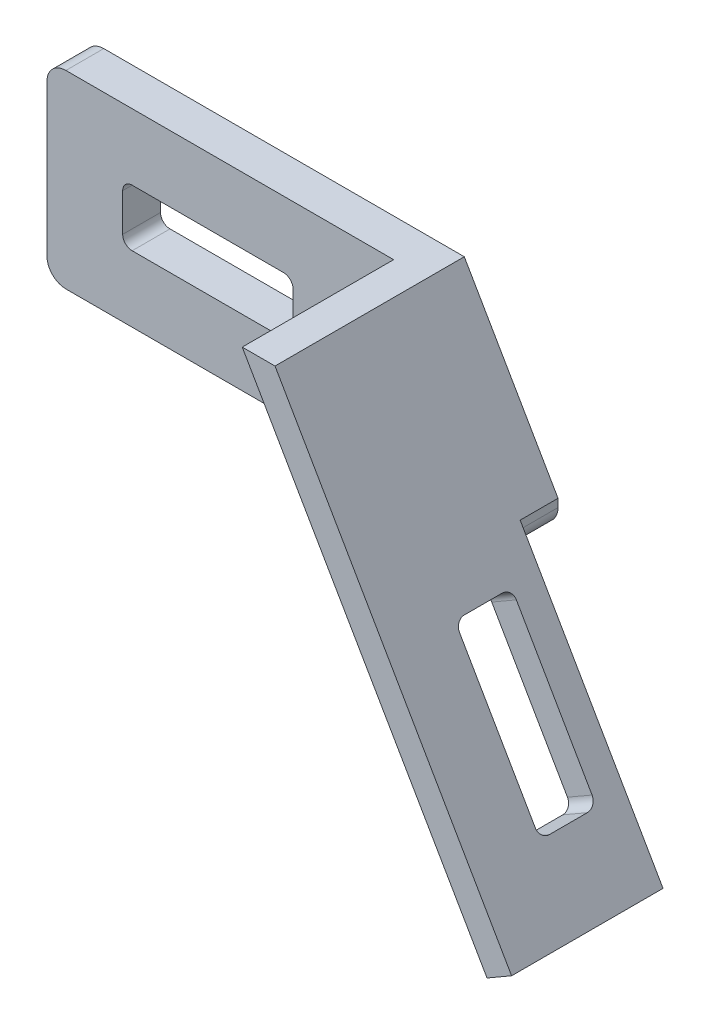
ISO-10303-21;
HEADER;
FILE_DESCRIPTION(('STEP AP214'),'2;1');
FILE_NAME('part.step','',(''),(''),'','','');
FILE_SCHEMA(('AUTOMOTIVE_DESIGN { 1 0 10303 214 1 1 1 1 }'));
ENDSEC;
DATA;
#1=APPLICATION_CONTEXT('core data for automotive mechanical design processes');
#2=APPLICATION_PROTOCOL_DEFINITION('international standard','automotive_design',2000,#1);
#3=PRODUCT_CONTEXT('',#1,'mechanical');
#4=PRODUCT('Part','Part','',(#3));
#5=PRODUCT_RELATED_PRODUCT_CATEGORY('part','',(#4));
#6=PRODUCT_DEFINITION_FORMATION('','',#4);
#7=PRODUCT_DEFINITION_CONTEXT('part definition',#1,'design');
#8=PRODUCT_DEFINITION('design','',#6,#7);
#9=PRODUCT_DEFINITION_SHAPE('','',#8);
#10=(LENGTH_UNIT() NAMED_UNIT(*) SI_UNIT(.MILLI.,.METRE.));
#11=(NAMED_UNIT(*) PLANE_ANGLE_UNIT() SI_UNIT($,.RADIAN.));
#12=(NAMED_UNIT(*) SI_UNIT($,.STERADIAN.) SOLID_ANGLE_UNIT());
#13=UNCERTAINTY_MEASURE_WITH_UNIT(LENGTH_MEASURE(1.E-05),#10,'distance_accuracy_value','');
#14=(GEOMETRIC_REPRESENTATION_CONTEXT(3) GLOBAL_UNCERTAINTY_ASSIGNED_CONTEXT((#13)) GLOBAL_UNIT_ASSIGNED_CONTEXT((#10,
#11,#12)) REPRESENTATION_CONTEXT('',''));
#15=CARTESIAN_POINT('',(0.,0.,0.));
#16=DIRECTION('',(0.,0.,1.));
#17=DIRECTION('',(1.,0.,0.));
#18=AXIS2_PLACEMENT_3D('',#15,#16,#17);
#19=CARTESIAN_POINT('',(34.7267267267267,6.70870870870871,4.));
#20=DIRECTION('',(0.,0.,-1.));
#21=DIRECTION('',(-1.,0.,0.));
#22=AXIS2_PLACEMENT_3D('',#19,#20,#21);
#23=PLANE('',#22);
#24=DIRECTION('',(0.,-1.,0.));
#25=VECTOR('',#24,1.);
#26=CARTESIAN_POINT('',(-5.27327327327327,0.708708708708703,4.));
#27=LINE('',#26,#25);
#28=CARTESIAN_POINT('',(-5.27327327327327,0.708708708708703,4.));
#29=VERTEX_POINT('',#28);
#30=CARTESIAN_POINT('',(-5.27327327327327,-3.29129129129128,4.));
#31=VERTEX_POINT('',#30);
#32=EDGE_CURVE('E449',#29,#31,#27,.T.);
#33=ORIENTED_EDGE('',*,*,#32,.F.);
#34=CARTESIAN_POINT('',(-4.27327327327327,0.708708708708711,4.));
#35=DIRECTION('',(0.,0.,1.));
#36=DIRECTION('',(-1.,0.,0.));
#37=AXIS2_PLACEMENT_3D('',#34,#35,#36);
#38=CIRCLE('',#37,1.);
#39=CARTESIAN_POINT('',(-4.27327327327327,1.70870870870871,4.));
#40=VERTEX_POINT('',#39);
#41=EDGE_CURVE('E447',#40,#29,#38,.T.);
#42=ORIENTED_EDGE('',*,*,#41,.F.);
#43=DIRECTION('',(-1.,0.,0.));
#44=VECTOR('',#43,1.);
#45=CARTESIAN_POINT('',(-4.27327327327327,1.70870870870871,4.));
#46=LINE('',#45,#44);
#47=CARTESIAN_POINT('',(11.7267267267267,1.70870870870871,4.));
#48=VERTEX_POINT('',#47);
#49=EDGE_CURVE('E335',#48,#40,#46,.T.);
#50=ORIENTED_EDGE('',*,*,#49,.F.);
#51=CARTESIAN_POINT('',(11.7267267267267,0.708708708708711,4.));
#52=DIRECTION('',(0.,0.,1.));
#53=DIRECTION('',(1.,0.,0.));
#54=AXIS2_PLACEMENT_3D('',#51,#52,#53);
#55=CIRCLE('',#54,1.);
#56=CARTESIAN_POINT('',(12.7267267267267,0.708708708708703,4.));
#57=VERTEX_POINT('',#56);
#58=EDGE_CURVE('E304',#57,#48,#55,.T.);
#59=ORIENTED_EDGE('',*,*,#58,.F.);
#60=DIRECTION('',(0.,1.,0.));
#61=VECTOR('',#60,1.);
#62=CARTESIAN_POINT('',(12.7267267267267,0.708708708708703,4.));
#63=LINE('',#62,#61);
#64=CARTESIAN_POINT('',(12.7267267267267,-3.29129129129129,4.));
#65=VERTEX_POINT('',#64);
#66=EDGE_CURVE('E459',#65,#57,#63,.T.);
#67=ORIENTED_EDGE('',*,*,#66,.F.);
#68=CARTESIAN_POINT('',(11.7267267267267,-3.29129129129129,4.));
#69=DIRECTION('',(0.,0.,1.));
#70=DIRECTION('',(1.,0.,0.));
#71=AXIS2_PLACEMENT_3D('',#68,#69,#70);
#72=CIRCLE('',#71,1.);
#73=CARTESIAN_POINT('',(11.7267267267267,-4.29129129129129,4.));
#74=VERTEX_POINT('',#73);
#75=EDGE_CURVE('E321',#74,#65,#72,.T.);
#76=ORIENTED_EDGE('',*,*,#75,.F.);
#77=DIRECTION('',(1.,0.,0.));
#78=VECTOR('',#77,1.);
#79=CARTESIAN_POINT('',(-4.27327327327327,-4.29129129129129,4.));
#80=LINE('',#79,#78);
#81=CARTESIAN_POINT('',(-4.27327327327327,-4.29129129129129,4.));
#82=VERTEX_POINT('',#81);
#83=EDGE_CURVE('E455',#82,#74,#80,.T.);
#84=ORIENTED_EDGE('',*,*,#83,.F.);
#85=CARTESIAN_POINT('',(-4.27327327327327,-3.29129129129129,4.));
#86=DIRECTION('',(0.,0.,1.));
#87=DIRECTION('',(1.,0.,0.));
#88=AXIS2_PLACEMENT_3D('',#85,#86,#87);
#89=CIRCLE('',#88,1.);
#90=EDGE_CURVE('E452',#31,#82,#89,.T.);
#91=ORIENTED_EDGE('',*,*,#90,.F.);
#92=EDGE_LOOP('',(#33,#42,#50,#59,#67,#76,#84,#91));
#93=FACE_BOUND('',#92,.T.);
#94=DIRECTION('',(0.500000000000005,-0.866025403784436,0.));
#95=VECTOR('',#94,1.);
#96=CARTESIAN_POINT('',(49.2252519929675,-36.0925614805131,4.));
#97=LINE('',#96,#95);
#98=CARTESIAN_POINT('',(23.3592265891828,8.70870870870871,4.));
#99=VERTEX_POINT('',#98);
#100=CARTESIAN_POINT('',(34.901799452728,-11.2836139410171,4.));
#101=VERTEX_POINT('',#100);
#102=EDGE_CURVE('E430',#99,#101,#97,.T.);
#103=ORIENTED_EDGE('',*,*,#102,.F.);
#104=DIRECTION('',(-1.,0.,0.));
#105=VECTOR('',#104,1.);
#106=CARTESIAN_POINT('',(-11.2732732732733,8.70870870870871,4.));
#107=LINE('',#106,#105);
#108=CARTESIAN_POINT('',(-11.2732732732733,8.70870870870871,4.));
#109=VERTEX_POINT('',#108);
#110=EDGE_CURVE('E261',#99,#109,#107,.T.);
#111=ORIENTED_EDGE('',*,*,#110,.T.);
#112=CARTESIAN_POINT('',(-11.2732732732733,6.70870870870871,4.));
#113=DIRECTION('',(0.,0.,1.));
#114=DIRECTION('',(-1.,0.,0.));
#115=AXIS2_PLACEMENT_3D('',#112,#113,#114);
#116=CIRCLE('',#115,2.);
#117=CARTESIAN_POINT('',(-13.2732732732733,6.7087087087087,4.));
#118=VERTEX_POINT('',#117);
#119=EDGE_CURVE('E337',#109,#118,#116,.T.);
#120=ORIENTED_EDGE('',*,*,#119,.T.);
#121=DIRECTION('',(0.,-1.,0.));
#122=VECTOR('',#121,1.);
#123=CARTESIAN_POINT('',(-13.2732732732733,6.7087087087087,4.));
#124=LINE('',#123,#122);
#125=CARTESIAN_POINT('',(-13.2732732732733,-9.29129129129128,4.));
#126=VERTEX_POINT('',#125);
#127=EDGE_CURVE('E339',#118,#126,#124,.T.);
#128=ORIENTED_EDGE('',*,*,#127,.T.);
#129=CARTESIAN_POINT('',(-11.2732732732733,-9.29129129129129,4.));
#130=DIRECTION('',(0.,0.,1.));
#131=DIRECTION('',(-1.,0.,0.));
#132=AXIS2_PLACEMENT_3D('',#129,#130,#131);
#133=CIRCLE('',#132,2.);
#134=CARTESIAN_POINT('',(-11.2732732732733,-11.2912912912913,4.));
#135=VERTEX_POINT('',#134);
#136=EDGE_CURVE('E341',#126,#135,#133,.T.);
#137=ORIENTED_EDGE('',*,*,#136,.T.);
#138=DIRECTION('',(1.,0.,0.));
#139=VECTOR('',#138,1.);
#140=CARTESIAN_POINT('',(-11.2732732732733,-11.2912912912913,4.));
#141=LINE('',#140,#139);
#142=CARTESIAN_POINT('',(34.7267267267267,-11.2912912912913,4.));
#143=VERTEX_POINT('',#142);
#144=EDGE_CURVE('E343',#135,#143,#141,.T.);
#145=ORIENTED_EDGE('',*,*,#144,.T.);
#146=CARTESIAN_POINT('',(34.7267267267267,-9.29129129129129,4.));
#147=DIRECTION('',(0.,0.,1.));
#148=DIRECTION('',(-1.,0.,0.));
#149=AXIS2_PLACEMENT_3D('',#146,#147,#148);
#150=CIRCLE('',#149,2.);
#151=EDGE_CURVE('E345',#143,#101,#150,.T.);
#152=ORIENTED_EDGE('',*,*,#151,.T.);
#153=EDGE_LOOP('',(#103,#111,#120,#128,#137,#145,#152));
#154=FACE_BOUND('',#153,.T.);
#155=ADVANCED_FACE('F35',(#93,#154),#23,.F.);
#156=CARTESIAN_POINT('',(-11.2732732732733,8.70870870870871,4.));
#157=DIRECTION('',(0.,-1.,0.));
#158=DIRECTION('',(0.,0.,-1.));
#159=AXIS2_PLACEMENT_3D('',#156,#157,#158);
#160=PLANE('',#159);
#161=DIRECTION('',(0.,0.,-1.));
#162=VECTOR('',#161,1.);
#163=CARTESIAN_POINT('',(26.8233282043206,8.70870870870871,20.));
#164=LINE('',#163,#162);
#165=CARTESIAN_POINT('',(26.8233282043206,8.70870870870871,20.));
#166=VERTEX_POINT('',#165);
#167=CARTESIAN_POINT('',(26.8233282043206,8.70870870870871,0.));
#168=VERTEX_POINT('',#167);
#169=EDGE_CURVE('E216',#166,#168,#164,.T.);
#170=ORIENTED_EDGE('',*,*,#169,.T.);
#171=DIRECTION('',(-1.,0.,0.));
#172=VECTOR('',#171,1.);
#173=CARTESIAN_POINT('',(-11.2732732732733,8.70870870870871,0.));
#174=LINE('',#173,#172);
#175=CARTESIAN_POINT('',(-11.2732732732733,8.70870870870871,0.));
#176=VERTEX_POINT('',#175);
#177=EDGE_CURVE('E220',#168,#176,#174,.T.);
#178=ORIENTED_EDGE('',*,*,#177,.T.);
#179=DIRECTION('',(0.,0.,-1.));
#180=VECTOR('',#179,1.);
#181=CARTESIAN_POINT('',(-11.2732732732733,8.70870870870871,4.));
#182=LINE('',#181,#180);
#183=EDGE_CURVE('E277',#109,#176,#182,.T.);
#184=ORIENTED_EDGE('',*,*,#183,.F.);
#185=ORIENTED_EDGE('',*,*,#110,.F.);
#186=DIRECTION('',(0.,0.,-1.));
#187=VECTOR('',#186,1.);
#188=CARTESIAN_POINT('',(23.3592265891828,8.70870870870871,20.));
#189=LINE('',#188,#187);
#190=CARTESIAN_POINT('',(23.3592265891828,8.70870870870871,20.));
#191=VERTEX_POINT('',#190);
#192=EDGE_CURVE('E226',#191,#99,#189,.T.);
#193=ORIENTED_EDGE('',*,*,#192,.F.);
#194=DIRECTION('',(-1.,0.,0.));
#195=VECTOR('',#194,1.);
#196=CARTESIAN_POINT('',(25.6686276659413,8.70870870870871,20.));
#197=LINE('',#196,#195);
#198=EDGE_CURVE('E223',#166,#191,#197,.T.);
#199=ORIENTED_EDGE('',*,*,#198,.F.);
#200=EDGE_LOOP('',(#170,#178,#184,#185,#193,#199));
#201=FACE_BOUND('',#200,.T.);
#202=ADVANCED_FACE('F37',(#201),#160,.F.);
#203=CARTESIAN_POINT('',(-11.2732732732733,6.70870870870871,4.));
#204=DIRECTION('',(0.,0.,-1.));
#205=DIRECTION('',(-1.,0.,0.));
#206=AXIS2_PLACEMENT_3D('',#203,#204,#205);
#207=CYLINDRICAL_SURFACE('',#206,2.);
#208=CARTESIAN_POINT('',(-11.2732732732733,6.70870870870871,0.));
#209=DIRECTION('',(0.,0.,1.));
#210=DIRECTION('',(-1.,0.,0.));
#211=AXIS2_PLACEMENT_3D('',#208,#209,#210);
#212=CIRCLE('',#211,2.);
#213=CARTESIAN_POINT('',(-13.2732732732733,6.7087087087087,0.));
#214=VERTEX_POINT('',#213);
#215=EDGE_CURVE('E241',#176,#214,#212,.T.);
#216=ORIENTED_EDGE('',*,*,#215,.T.);
#217=DIRECTION('',(0.,0.,-1.));
#218=VECTOR('',#217,1.);
#219=CARTESIAN_POINT('',(-13.2732732732733,6.7087087087087,4.));
#220=LINE('',#219,#218);
#221=EDGE_CURVE('E274',#118,#214,#220,.T.);
#222=ORIENTED_EDGE('',*,*,#221,.F.);
#223=ORIENTED_EDGE('',*,*,#119,.F.);
#224=ORIENTED_EDGE('',*,*,#183,.T.);
#225=EDGE_LOOP('',(#216,#222,#223,#224));
#226=FACE_BOUND('',#225,.T.);
#227=ADVANCED_FACE('F492',(#226),#207,.T.);
#228=CARTESIAN_POINT('',(-13.2732732732733,6.7087087087087,4.));
#229=DIRECTION('',(1.,0.,0.));
#230=DIRECTION('',(0.,0.,-1.));
#231=AXIS2_PLACEMENT_3D('',#228,#229,#230);
#232=PLANE('',#231);
#233=DIRECTION('',(0.,-1.,0.));
#234=VECTOR('',#233,1.);
#235=CARTESIAN_POINT('',(-13.2732732732733,6.7087087087087,0.));
#236=LINE('',#235,#234);
#237=CARTESIAN_POINT('',(-13.2732732732733,-9.29129129129128,0.));
#238=VERTEX_POINT('',#237);
#239=EDGE_CURVE('E244',#214,#238,#236,.T.);
#240=ORIENTED_EDGE('',*,*,#239,.T.);
#241=DIRECTION('',(0.,0.,-1.));
#242=VECTOR('',#241,1.);
#243=CARTESIAN_POINT('',(-13.2732732732733,-9.29129129129128,4.));
#244=LINE('',#243,#242);
#245=EDGE_CURVE('E271',#126,#238,#244,.T.);
#246=ORIENTED_EDGE('',*,*,#245,.F.);
#247=ORIENTED_EDGE('',*,*,#127,.F.);
#248=ORIENTED_EDGE('',*,*,#221,.T.);
#249=EDGE_LOOP('',(#240,#246,#247,#248));
#250=FACE_BOUND('',#249,.T.);
#251=ADVANCED_FACE('F509',(#250),#232,.F.);
#252=CARTESIAN_POINT('',(-11.2732732732733,-9.29129129129129,4.));
#253=DIRECTION('',(0.,0.,-1.));
#254=DIRECTION('',(-1.,0.,0.));
#255=AXIS2_PLACEMENT_3D('',#252,#253,#254);
#256=CYLINDRICAL_SURFACE('',#255,2.);
#257=CARTESIAN_POINT('',(-11.2732732732733,-9.29129129129129,0.));
#258=DIRECTION('',(0.,0.,1.));
#259=DIRECTION('',(-1.,0.,0.));
#260=AXIS2_PLACEMENT_3D('',#257,#258,#259);
#261=CIRCLE('',#260,2.);
#262=CARTESIAN_POINT('',(-11.2732732732733,-11.2912912912913,0.));
#263=VERTEX_POINT('',#262);
#264=EDGE_CURVE('E253',#238,#263,#261,.T.);
#265=ORIENTED_EDGE('',*,*,#264,.T.);
#266=DIRECTION('',(0.,0.,-1.));
#267=VECTOR('',#266,1.);
#268=CARTESIAN_POINT('',(-11.2732732732733,-11.2912912912913,4.));
#269=LINE('',#268,#267);
#270=EDGE_CURVE('E268',#135,#263,#269,.T.);
#271=ORIENTED_EDGE('',*,*,#270,.F.);
#272=ORIENTED_EDGE('',*,*,#136,.F.);
#273=ORIENTED_EDGE('',*,*,#245,.T.);
#274=EDGE_LOOP('',(#265,#271,#272,#273));
#275=FACE_BOUND('',#274,.T.);
#276=ADVANCED_FACE('F505',(#275),#256,.T.);
#277=CARTESIAN_POINT('',(-11.2732732732733,-11.2912912912913,4.));
#278=DIRECTION('',(0.,1.,0.));
#279=DIRECTION('',(0.,0.,1.));
#280=AXIS2_PLACEMENT_3D('',#277,#278,#279);
#281=PLANE('',#280);
#282=DIRECTION('',(1.,0.,0.));
#283=VECTOR('',#282,1.);
#284=CARTESIAN_POINT('',(-11.2732732732733,-11.2912912912913,0.));
#285=LINE('',#284,#283);
#286=CARTESIAN_POINT('',(34.7267267267267,-11.2912912912913,0.));
#287=VERTEX_POINT('',#286);
#288=EDGE_CURVE('E255',#263,#287,#285,.T.);
#289=ORIENTED_EDGE('',*,*,#288,.T.);
#290=DIRECTION('',(0.,0.,-1.));
#291=VECTOR('',#290,1.);
#292=CARTESIAN_POINT('',(34.7267267267267,-11.2912912912913,4.));
#293=LINE('',#292,#291);
#294=EDGE_CURVE('E265',#143,#287,#293,.T.);
#295=ORIENTED_EDGE('',*,*,#294,.F.);
#296=ORIENTED_EDGE('',*,*,#144,.F.);
#297=ORIENTED_EDGE('',*,*,#270,.T.);
#298=EDGE_LOOP('',(#289,#295,#296,#297));
#299=FACE_BOUND('',#298,.T.);
#300=ADVANCED_FACE('F502',(#299),#281,.F.);
#301=CARTESIAN_POINT('',(34.7267267267267,-9.29129129129129,4.));
#302=DIRECTION('',(0.,0.,-1.));
#303=DIRECTION('',(-1.,0.,0.));
#304=AXIS2_PLACEMENT_3D('',#301,#302,#303);
#305=CYLINDRICAL_SURFACE('',#304,2.);
#306=CARTESIAN_POINT('',(34.7267267267267,-9.29129129129129,0.));
#307=DIRECTION('',(0.,0.,1.));
#308=DIRECTION('',(-1.,0.,0.));
#309=AXIS2_PLACEMENT_3D('',#306,#307,#308);
#310=CIRCLE('',#309,2.);
#311=CARTESIAN_POINT('',(36.7267267267267,-9.29129129129129,0.));
#312=VERTEX_POINT('',#311);
#313=EDGE_CURVE('E257',#287,#312,#310,.T.);
#314=ORIENTED_EDGE('',*,*,#313,.T.);
#315=DIRECTION('',(0.,0.,-1.));
#316=VECTOR('',#315,1.);
#317=CARTESIAN_POINT('',(36.7267267267267,-9.29129129129129,4.));
#318=LINE('',#317,#316);
#319=CARTESIAN_POINT('',(36.7267267267267,-9.29129129129129,4.));
#320=VERTEX_POINT('',#319);
#321=EDGE_CURVE('E262',#320,#312,#318,.T.);
#322=ORIENTED_EDGE('',*,*,#321,.F.);
#323=EDGE_CURVE('E344',#101,#320,#150,.T.);
#324=ORIENTED_EDGE('',*,*,#323,.F.);
#325=ORIENTED_EDGE('',*,*,#151,.F.);
#326=ORIENTED_EDGE('',*,*,#294,.T.);
#327=EDGE_LOOP('',(#314,#322,#324,#325,#326));
#328=FACE_BOUND('',#327,.T.);
#329=ADVANCED_FACE('F359',(#328),#305,.T.);
#330=CARTESIAN_POINT('',(36.7267267267267,6.70870870870871,4.));
#331=DIRECTION('',(-1.,0.,0.));
#332=DIRECTION('',(0.,0.,1.));
#333=AXIS2_PLACEMENT_3D('',#330,#331,#332);
#334=PLANE('',#333);
#335=DIRECTION('',(0.,1.,0.));
#336=VECTOR('',#335,1.);
#337=CARTESIAN_POINT('',(36.7267267267267,6.70870870870871,0.));
#338=LINE('',#337,#336);
#339=CARTESIAN_POINT('',(36.7267267267268,-8.44448069970108,0.));
#340=VERTEX_POINT('',#339);
#341=EDGE_CURVE('E259',#312,#340,#338,.T.);
#342=ORIENTED_EDGE('',*,*,#341,.T.);
#343=DIRECTION('',(0.,0.,1.));
#344=VECTOR('',#343,1.);
#345=CARTESIAN_POINT('',(36.7267267267267,-8.44448069970109,4.));
#346=LINE('',#345,#344);
#347=CARTESIAN_POINT('',(36.7267267267267,-8.444480699701,4.));
#348=VERTEX_POINT('',#347);
#349=EDGE_CURVE('E232',#340,#348,#346,.T.);
#350=ORIENTED_EDGE('',*,*,#349,.T.);
#351=DIRECTION('',(0.,1.,0.));
#352=VECTOR('',#351,1.);
#353=CARTESIAN_POINT('',(36.7267267267267,6.70870870870871,4.));
#354=LINE('',#353,#352);
#355=EDGE_CURVE('E249',#320,#348,#354,.T.);
#356=ORIENTED_EDGE('',*,*,#355,.F.);
#357=ORIENTED_EDGE('',*,*,#321,.T.);
#358=EDGE_LOOP('',(#342,#350,#356,#357));
#359=FACE_BOUND('',#358,.T.);
#360=ADVANCED_FACE('F362',(#359),#334,.F.);
#361=CARTESIAN_POINT('',(34.7267267267267,6.70870870870871,0.));
#362=DIRECTION('',(0.,0.,-1.));
#363=DIRECTION('',(-1.,0.,0.));
#364=AXIS2_PLACEMENT_3D('',#361,#362,#363);
#365=PLANE('',#364);
#366=DIRECTION('',(0.500000000000006,-0.866025403784435,0.));
#367=VECTOR('',#366,1.);
#368=CARTESIAN_POINT('',(27.4006784735102,7.70870870870872,0.));
#369=LINE('',#368,#367);
#370=EDGE_CURVE('E229',#168,#340,#369,.T.);
#371=ORIENTED_EDGE('',*,*,#370,.T.);
#372=ORIENTED_EDGE('',*,*,#341,.F.);
#373=ORIENTED_EDGE('',*,*,#313,.F.);
#374=ORIENTED_EDGE('',*,*,#288,.F.);
#375=ORIENTED_EDGE('',*,*,#264,.F.);
#376=ORIENTED_EDGE('',*,*,#239,.F.);
#377=ORIENTED_EDGE('',*,*,#215,.F.);
#378=ORIENTED_EDGE('',*,*,#177,.F.);
#379=EDGE_LOOP('',(#371,#372,#373,#374,#375,#376,#377,#378));
#380=FACE_BOUND('',#379,.T.);
#381=CARTESIAN_POINT('',(-4.27327327327327,0.708708708708711,0.));
#382=DIRECTION('',(0.,0.,-1.));
#383=DIRECTION('',(-1.,0.,0.));
#384=AXIS2_PLACEMENT_3D('',#381,#382,#383);
#385=CIRCLE('',#384,1.);
#386=CARTESIAN_POINT('',(-5.27327327327327,0.708708708708703,0.));
#387=VERTEX_POINT('',#386);
#388=CARTESIAN_POINT('',(-4.27327327327327,1.70870870870871,0.));
#389=VERTEX_POINT('',#388);
#390=EDGE_CURVE('E11',#387,#389,#385,.T.);
#391=ORIENTED_EDGE('',*,*,#390,.F.);
#392=DIRECTION('',(0.,1.,0.));
#393=VECTOR('',#392,1.);
#394=CARTESIAN_POINT('',(-5.27327327327327,6.70870870870871,0.));
#395=LINE('',#394,#393);
#396=CARTESIAN_POINT('',(-5.27327327327327,-3.29129129129128,0.));
#397=VERTEX_POINT('',#396);
#398=EDGE_CURVE('E279',#397,#387,#395,.T.);
#399=ORIENTED_EDGE('',*,*,#398,.F.);
#400=CARTESIAN_POINT('',(-4.27327327327327,-3.29129129129129,0.));
#401=DIRECTION('',(0.,0.,-1.));
#402=DIRECTION('',(-1.,0.,0.));
#403=AXIS2_PLACEMENT_3D('',#400,#401,#402);
#404=CIRCLE('',#403,1.);
#405=CARTESIAN_POINT('',(-4.27327327327327,-4.29129129129129,0.));
#406=VERTEX_POINT('',#405);
#407=EDGE_CURVE('E281',#406,#397,#404,.T.);
#408=ORIENTED_EDGE('',*,*,#407,.F.);
#409=DIRECTION('',(-1.,0.,0.));
#410=VECTOR('',#409,1.);
#411=CARTESIAN_POINT('',(34.7267267267267,-4.29129129129129,0.));
#412=LINE('',#411,#410);
#413=CARTESIAN_POINT('',(11.7267267267267,-4.29129129129129,0.));
#414=VERTEX_POINT('',#413);
#415=EDGE_CURVE('E284',#414,#406,#412,.T.);
#416=ORIENTED_EDGE('',*,*,#415,.F.);
#417=CARTESIAN_POINT('',(11.7267267267267,-3.29129129129129,0.));
#418=DIRECTION('',(0.,0.,-1.));
#419=DIRECTION('',(-1.,0.,0.));
#420=AXIS2_PLACEMENT_3D('',#417,#418,#419);
#421=CIRCLE('',#420,1.);
#422=CARTESIAN_POINT('',(12.7267267267267,-3.29129129129129,0.));
#423=VERTEX_POINT('',#422);
#424=EDGE_CURVE('E286',#423,#414,#421,.T.);
#425=ORIENTED_EDGE('',*,*,#424,.F.);
#426=DIRECTION('',(0.,-1.,0.));
#427=VECTOR('',#426,1.);
#428=CARTESIAN_POINT('',(12.7267267267267,6.70870870870871,0.));
#429=LINE('',#428,#427);
#430=CARTESIAN_POINT('',(12.7267267267267,0.708708708708703,0.));
#431=VERTEX_POINT('',#430);
#432=EDGE_CURVE('E288',#431,#423,#429,.T.);
#433=ORIENTED_EDGE('',*,*,#432,.F.);
#434=CARTESIAN_POINT('',(11.7267267267267,0.708708708708711,0.));
#435=DIRECTION('',(0.,0.,-1.));
#436=DIRECTION('',(-1.,0.,0.));
#437=AXIS2_PLACEMENT_3D('',#434,#435,#436);
#438=CIRCLE('',#437,1.);
#439=CARTESIAN_POINT('',(11.7267267267267,1.70870870870871,0.));
#440=VERTEX_POINT('',#439);
#441=EDGE_CURVE('E290',#440,#431,#438,.T.);
#442=ORIENTED_EDGE('',*,*,#441,.F.);
#443=DIRECTION('',(1.,0.,0.));
#444=VECTOR('',#443,1.);
#445=CARTESIAN_POINT('',(34.7267267267267,1.70870870870871,0.));
#446=LINE('',#445,#444);
#447=EDGE_CURVE('E43',#389,#440,#446,.T.);
#448=ORIENTED_EDGE('',*,*,#447,.F.);
#449=EDGE_LOOP('',(#391,#399,#408,#416,#425,#433,#442,#448));
#450=FACE_BOUND('',#449,.T.);
#451=ADVANCED_FACE('F238',(#380,#450),#365,.T.);
#452=CARTESIAN_POINT('',(-4.27327327327327,0.708708708708711,-46.));
#453=DIRECTION('',(0.,0.,1.));
#454=DIRECTION('',(1.,0.,0.));
#455=AXIS2_PLACEMENT_3D('',#452,#453,#454);
#456=CYLINDRICAL_SURFACE('',#455,1.);
#457=ORIENTED_EDGE('',*,*,#390,.T.);
#458=DIRECTION('',(0.,0.,1.));
#459=VECTOR('',#458,1.);
#460=CARTESIAN_POINT('',(-4.27327327327327,1.70870870870871,-46.));
#461=LINE('',#460,#459);
#462=EDGE_CURVE('E242',#389,#40,#461,.T.);
#463=ORIENTED_EDGE('',*,*,#462,.T.);
#464=ORIENTED_EDGE('',*,*,#41,.T.);
#465=DIRECTION('',(0.,0.,1.));
#466=VECTOR('',#465,1.);
#467=CARTESIAN_POINT('',(-5.27327327327327,0.708708708708703,-46.));
#468=LINE('',#467,#466);
#469=EDGE_CURVE('E332',#387,#29,#468,.T.);
#470=ORIENTED_EDGE('',*,*,#469,.F.);
#471=EDGE_LOOP('',(#457,#463,#464,#470));
#472=FACE_BOUND('',#471,.T.);
#473=ADVANCED_FACE('F468',(#472),#456,.F.);
#474=CARTESIAN_POINT('',(-4.27327327327327,1.70870870870871,-46.));
#475=DIRECTION('',(0.,1.,0.));
#476=DIRECTION('',(0.,0.,1.));
#477=AXIS2_PLACEMENT_3D('',#474,#475,#476);
#478=PLANE('',#477);
#479=ORIENTED_EDGE('',*,*,#447,.T.);
#480=DIRECTION('',(0.,0.,1.));
#481=VECTOR('',#480,1.);
#482=CARTESIAN_POINT('',(11.7267267267267,1.70870870870871,-46.));
#483=LINE('',#482,#481);
#484=EDGE_CURVE('E246',#440,#48,#483,.T.);
#485=ORIENTED_EDGE('',*,*,#484,.T.);
#486=ORIENTED_EDGE('',*,*,#49,.T.);
#487=ORIENTED_EDGE('',*,*,#462,.F.);
#488=EDGE_LOOP('',(#479,#485,#486,#487));
#489=FACE_BOUND('',#488,.T.);
#490=ADVANCED_FACE('F295',(#489),#478,.F.);
#491=CARTESIAN_POINT('',(11.7267267267267,0.708708708708711,-46.));
#492=DIRECTION('',(0.,0.,1.));
#493=DIRECTION('',(1.,0.,0.));
#494=AXIS2_PLACEMENT_3D('',#491,#492,#493);
#495=CYLINDRICAL_SURFACE('',#494,1.);
#496=ORIENTED_EDGE('',*,*,#441,.T.);
#497=DIRECTION('',(0.,0.,1.));
#498=VECTOR('',#497,1.);
#499=CARTESIAN_POINT('',(12.7267267267267,0.708708708708703,-46.));
#500=LINE('',#499,#498);
#501=EDGE_CURVE('E306',#431,#57,#500,.T.);
#502=ORIENTED_EDGE('',*,*,#501,.T.);
#503=ORIENTED_EDGE('',*,*,#58,.T.);
#504=ORIENTED_EDGE('',*,*,#484,.F.);
#505=EDGE_LOOP('',(#496,#502,#503,#504));
#506=FACE_BOUND('',#505,.T.);
#507=ADVANCED_FACE('F301',(#506),#495,.F.);
#508=CARTESIAN_POINT('',(12.7267267267267,0.708708708708703,-46.));
#509=DIRECTION('',(1.,0.,0.));
#510=DIRECTION('',(0.,0.,-1.));
#511=AXIS2_PLACEMENT_3D('',#508,#509,#510);
#512=PLANE('',#511);
#513=ORIENTED_EDGE('',*,*,#432,.T.);
#514=DIRECTION('',(0.,0.,1.));
#515=VECTOR('',#514,1.);
#516=CARTESIAN_POINT('',(12.7267267267267,-3.29129129129129,-46.));
#517=LINE('',#516,#515);
#518=EDGE_CURVE('E315',#423,#65,#517,.T.);
#519=ORIENTED_EDGE('',*,*,#518,.T.);
#520=ORIENTED_EDGE('',*,*,#66,.T.);
#521=ORIENTED_EDGE('',*,*,#501,.F.);
#522=EDGE_LOOP('',(#513,#519,#520,#521));
#523=FACE_BOUND('',#522,.T.);
#524=ADVANCED_FACE('F313',(#523),#512,.F.);
#525=CARTESIAN_POINT('',(11.7267267267267,-3.29129129129129,-46.));
#526=DIRECTION('',(0.,0.,1.));
#527=DIRECTION('',(1.,0.,0.));
#528=AXIS2_PLACEMENT_3D('',#525,#526,#527);
#529=CYLINDRICAL_SURFACE('',#528,1.);
#530=ORIENTED_EDGE('',*,*,#424,.T.);
#531=DIRECTION('',(0.,0.,1.));
#532=VECTOR('',#531,1.);
#533=CARTESIAN_POINT('',(11.7267267267267,-4.29129129129129,-46.));
#534=LINE('',#533,#532);
#535=EDGE_CURVE('E323',#414,#74,#534,.T.);
#536=ORIENTED_EDGE('',*,*,#535,.T.);
#537=ORIENTED_EDGE('',*,*,#75,.T.);
#538=ORIENTED_EDGE('',*,*,#518,.F.);
#539=EDGE_LOOP('',(#530,#536,#537,#538));
#540=FACE_BOUND('',#539,.T.);
#541=ADVANCED_FACE('F318',(#540),#529,.F.);
#542=CARTESIAN_POINT('',(-4.27327327327327,-4.29129129129129,-46.));
#543=DIRECTION('',(0.,-1.,0.));
#544=DIRECTION('',(0.,0.,-1.));
#545=AXIS2_PLACEMENT_3D('',#542,#543,#544);
#546=PLANE('',#545);
#547=ORIENTED_EDGE('',*,*,#415,.T.);
#548=DIRECTION('',(0.,0.,1.));
#549=VECTOR('',#548,1.);
#550=CARTESIAN_POINT('',(-4.27327327327327,-4.29129129129129,-46.));
#551=LINE('',#550,#549);
#552=EDGE_CURVE('E326',#406,#82,#551,.T.);
#553=ORIENTED_EDGE('',*,*,#552,.T.);
#554=ORIENTED_EDGE('',*,*,#83,.T.);
#555=ORIENTED_EDGE('',*,*,#535,.F.);
#556=EDGE_LOOP('',(#547,#553,#554,#555));
#557=FACE_BOUND('',#556,.T.);
#558=ADVANCED_FACE('F478',(#557),#546,.F.);
#559=CARTESIAN_POINT('',(-4.27327327327327,-3.29129129129129,-46.));
#560=DIRECTION('',(0.,0.,1.));
#561=DIRECTION('',(1.,0.,0.));
#562=AXIS2_PLACEMENT_3D('',#559,#560,#561);
#563=CYLINDRICAL_SURFACE('',#562,1.);
#564=ORIENTED_EDGE('',*,*,#407,.T.);
#565=DIRECTION('',(0.,0.,1.));
#566=VECTOR('',#565,1.);
#567=CARTESIAN_POINT('',(-5.27327327327327,-3.29129129129128,-46.));
#568=LINE('',#567,#566);
#569=EDGE_CURVE('E330',#397,#31,#568,.T.);
#570=ORIENTED_EDGE('',*,*,#569,.T.);
#571=ORIENTED_EDGE('',*,*,#90,.T.);
#572=ORIENTED_EDGE('',*,*,#552,.F.);
#573=EDGE_LOOP('',(#564,#570,#571,#572));
#574=FACE_BOUND('',#573,.T.);
#575=ADVANCED_FACE('F475',(#574),#563,.F.);
#576=CARTESIAN_POINT('',(-5.27327327327327,0.708708708708703,-46.));
#577=DIRECTION('',(-1.,0.,0.));
#578=DIRECTION('',(0.,0.,1.));
#579=AXIS2_PLACEMENT_3D('',#576,#577,#578);
#580=PLANE('',#579);
#581=ORIENTED_EDGE('',*,*,#398,.T.);
#582=ORIENTED_EDGE('',*,*,#469,.T.);
#583=ORIENTED_EDGE('',*,*,#32,.T.);
#584=ORIENTED_EDGE('',*,*,#569,.F.);
#585=EDGE_LOOP('',(#581,#582,#583,#584));
#586=FACE_BOUND('',#585,.T.);
#587=ADVANCED_FACE('F470',(#586),#580,.F.);
#588=CARTESIAN_POINT('',(51.8233282043208,-34.5925614805131,20.));
#589=DIRECTION('',(-0.500000000000005,0.866025403784436,0.));
#590=DIRECTION('',(-0.866025403784436,-0.500000000000005,0.));
#591=AXIS2_PLACEMENT_3D('',#588,#589,#590);
#592=PLANE('',#591);
#593=DIRECTION('',(0.866025403784436,0.500000000000005,0.));
#594=VECTOR('',#593,1.);
#595=CARTESIAN_POINT('',(51.8233282043208,-34.5925614805131,4.));
#596=LINE('',#595,#594);
#597=CARTESIAN_POINT('',(49.2252519929675,-36.0925614805131,4.));
#598=VERTEX_POINT('',#597);
#599=CARTESIAN_POINT('',(51.8233282043208,-34.5925614805131,4.));
#600=VERTEX_POINT('',#599);
#601=EDGE_CURVE('E425',#598,#600,#596,.T.);
#602=ORIENTED_EDGE('',*,*,#601,.T.);
#603=DIRECTION('',(0.,0.,-1.));
#604=VECTOR('',#603,1.);
#605=CARTESIAN_POINT('',(51.8233282043208,-34.5925614805131,20.));
#606=LINE('',#605,#604);
#607=CARTESIAN_POINT('',(51.8233282043208,-34.5925614805131,20.));
#608=VERTEX_POINT('',#607);
#609=EDGE_CURVE('E225',#608,#600,#606,.T.);
#610=ORIENTED_EDGE('',*,*,#609,.F.);
#611=DIRECTION('',(0.866025403784436,0.500000000000005,0.));
#612=VECTOR('',#611,1.);
#613=CARTESIAN_POINT('',(51.8233282043208,-34.5925614805131,20.));
#614=LINE('',#613,#612);
#615=CARTESIAN_POINT('',(49.2252519929675,-36.0925614805131,20.));
#616=VERTEX_POINT('',#615);
#617=EDGE_CURVE('E426',#616,#608,#614,.T.);
#618=ORIENTED_EDGE('',*,*,#617,.F.);
#619=DIRECTION('',(0.,0.,-1.));
#620=VECTOR('',#619,1.);
#621=CARTESIAN_POINT('',(49.2252519929675,-36.0925614805131,20.));
#622=LINE('',#621,#620);
#623=EDGE_CURVE('E435',#616,#598,#622,.T.);
#624=ORIENTED_EDGE('',*,*,#623,.T.);
#625=EDGE_LOOP('',(#602,#610,#618,#624));
#626=FACE_BOUND('',#625,.T.);
#627=ADVANCED_FACE('F537',(#626),#592,.F.);
#628=CARTESIAN_POINT('',(26.8233282043206,8.70870870870871,20.));
#629=DIRECTION('',(-0.866025403784435,-0.500000000000007,0.));
#630=DIRECTION('',(0.500000000000007,-0.866025403784435,0.));
#631=AXIS2_PLACEMENT_3D('',#628,#629,#630);
#632=PLANE('',#631);
#633=DIRECTION('',(0.500000000000007,-0.866025403784435,0.));
#634=VECTOR('',#633,1.);
#635=CARTESIAN_POINT('',(39.3233282043208,-12.9419263859022,13.));
#636=LINE('',#635,#634);
#637=CARTESIAN_POINT('',(39.3233282043207,-12.9419263859022,13.));
#638=VERTEX_POINT('',#637);
#639=CARTESIAN_POINT('',(47.3233282043209,-26.7983328464531,13.));
#640=VERTEX_POINT('',#639);
#641=EDGE_CURVE('E378',#638,#640,#636,.T.);
#642=ORIENTED_EDGE('',*,*,#641,.F.);
#643=CARTESIAN_POINT('',(39.3233282043207,-12.9419263859022,12.));
#644=DIRECTION('',(-0.866025403784435,-0.500000000000007,0.));
#645=DIRECTION('',(0.500000000000007,-0.866025403784435,0.));
#646=AXIS2_PLACEMENT_3D('',#643,#644,#645);
#647=CIRCLE('',#646,1.);
#648=CARTESIAN_POINT('',(38.8233282043207,-12.0759009821177,12.));
#649=VERTEX_POINT('',#648);
#650=EDGE_CURVE('E381',#649,#638,#647,.F.);
#651=ORIENTED_EDGE('',*,*,#650,.F.);
#652=DIRECTION('',(0.,0.,1.));
#653=VECTOR('',#652,1.);
#654=CARTESIAN_POINT('',(38.8233282043207,-12.0759009821177,8.));
#655=LINE('',#654,#653);
#656=CARTESIAN_POINT('',(38.8233282043207,-12.0759009821177,8.));
#657=VERTEX_POINT('',#656);
#658=EDGE_CURVE('E409',#657,#649,#655,.T.);
#659=ORIENTED_EDGE('',*,*,#658,.F.);
#660=CARTESIAN_POINT('',(39.3233282043207,-12.9419263859022,8.));
#661=DIRECTION('',(-0.866025403784435,-0.500000000000007,0.));
#662=DIRECTION('',(0.500000000000007,-0.866025403784435,0.));
#663=AXIS2_PLACEMENT_3D('',#660,#661,#662);
#664=CIRCLE('',#663,1.);
#665=CARTESIAN_POINT('',(39.3233282043207,-12.9419263859022,7.));
#666=VERTEX_POINT('',#665);
#667=EDGE_CURVE('E50',#666,#657,#664,.F.);
#668=ORIENTED_EDGE('',*,*,#667,.F.);
#669=DIRECTION('',(-0.500000000000007,0.866025403784435,0.));
#670=VECTOR('',#669,1.);
#671=CARTESIAN_POINT('',(39.3233282043208,-12.9419263859022,7.));
#672=LINE('',#671,#670);
#673=CARTESIAN_POINT('',(47.3233282043209,-26.7983328464531,7.));
#674=VERTEX_POINT('',#673);
#675=EDGE_CURVE('E364',#674,#666,#672,.T.);
#676=ORIENTED_EDGE('',*,*,#675,.F.);
#677=CARTESIAN_POINT('',(47.3233282043209,-26.7983328464531,8.));
#678=DIRECTION('',(-0.866025403784435,-0.500000000000007,0.));
#679=DIRECTION('',(0.500000000000007,-0.866025403784435,0.));
#680=AXIS2_PLACEMENT_3D('',#677,#678,#679);
#681=CIRCLE('',#680,1.);
#682=CARTESIAN_POINT('',(47.8233282043209,-27.6643582502375,8.));
#683=VERTEX_POINT('',#682);
#684=EDGE_CURVE('E369',#683,#674,#681,.F.);
#685=ORIENTED_EDGE('',*,*,#684,.F.);
#686=DIRECTION('',(0.,0.,-1.));
#687=VECTOR('',#686,1.);
#688=CARTESIAN_POINT('',(47.8233282043209,-27.6643582502375,8.));
#689=LINE('',#688,#687);
#690=CARTESIAN_POINT('',(47.8233282043209,-27.6643582502375,12.));
#691=VERTEX_POINT('',#690);
#692=EDGE_CURVE('E372',#691,#683,#689,.T.);
#693=ORIENTED_EDGE('',*,*,#692,.F.);
#694=CARTESIAN_POINT('',(47.3233282043209,-26.7983328464531,12.));
#695=DIRECTION('',(-0.866025403784435,-0.500000000000007,0.));
#696=DIRECTION('',(0.500000000000007,-0.866025403784435,0.));
#697=AXIS2_PLACEMENT_3D('',#694,#695,#696);
#698=CIRCLE('',#697,1.);
#699=EDGE_CURVE('E375',#640,#691,#698,.F.);
#700=ORIENTED_EDGE('',*,*,#699,.F.);
#701=EDGE_LOOP('',(#642,#651,#659,#668,#676,#685,#693,#700));
#702=FACE_BOUND('',#701,.T.);
#703=DIRECTION('',(-0.500000000000007,0.866025403784435,0.));
#704=VECTOR('',#703,1.);
#705=CARTESIAN_POINT('',(26.8233282043206,8.70870870870871,4.));
#706=LINE('',#705,#704);
#707=EDGE_CURVE('E438',#600,#348,#706,.T.);
#708=ORIENTED_EDGE('',*,*,#707,.T.);
#709=ORIENTED_EDGE('',*,*,#349,.F.);
#710=ORIENTED_EDGE('',*,*,#370,.F.);
#711=ORIENTED_EDGE('',*,*,#169,.F.);
#712=DIRECTION('',(-0.500000000000005,0.866025403784436,0.));
#713=VECTOR('',#712,1.);
#714=CARTESIAN_POINT('',(27.4006784735102,7.70870870870879,20.));
#715=LINE('',#714,#713);
#716=EDGE_CURVE('E429',#608,#166,#715,.T.);
#717=ORIENTED_EDGE('',*,*,#716,.F.);
#718=ORIENTED_EDGE('',*,*,#609,.T.);
#719=EDGE_LOOP('',(#708,#709,#710,#711,#717,#718));
#720=FACE_BOUND('',#719,.T.);
#721=ADVANCED_FACE('F230',(#702,#720),#632,.F.);
#722=CARTESIAN_POINT('',(49.2252519929675,-36.0925614805131,20.));
#723=DIRECTION('',(0.866025403784436,0.500000000000005,0.));
#724=DIRECTION('',(-0.500000000000005,0.866025403784436,0.));
#725=AXIS2_PLACEMENT_3D('',#722,#723,#724);
#726=PLANE('',#725);
#727=DIRECTION('',(0.,0.,-1.));
#728=VECTOR('',#727,1.);
#729=CARTESIAN_POINT('',(36.2252519929674,-13.5759009821178,8.));
#730=LINE('',#729,#728);
#731=CARTESIAN_POINT('',(36.2252519929674,-13.5759009821178,12.));
#732=VERTEX_POINT('',#731);
#733=CARTESIAN_POINT('',(36.2252519929674,-13.5759009821178,8.));
#734=VERTEX_POINT('',#733);
#735=EDGE_CURVE('E385',#732,#734,#730,.T.);
#736=ORIENTED_EDGE('',*,*,#735,.F.);
#737=CARTESIAN_POINT('',(36.7252519929674,-14.4419263859022,12.));
#738=DIRECTION('',(-0.866025403784436,-0.500000000000004,0.));
#739=DIRECTION('',(-0.500000000000004,0.866025403784436,0.));
#740=AXIS2_PLACEMENT_3D('',#737,#738,#739);
#741=CIRCLE('',#740,1.);
#742=CARTESIAN_POINT('',(36.7252519929674,-14.4419263859022,13.));
#743=VERTEX_POINT('',#742);
#744=EDGE_CURVE('E58',#743,#732,#741,.T.);
#745=ORIENTED_EDGE('',*,*,#744,.F.);
#746=DIRECTION('',(-0.500000000000004,0.866025403784436,0.));
#747=VECTOR('',#746,1.);
#748=CARTESIAN_POINT('',(36.7252519929674,-14.4419263859022,13.));
#749=LINE('',#748,#747);
#750=CARTESIAN_POINT('',(44.7252519929674,-28.2983328464532,13.));
#751=VERTEX_POINT('',#750);
#752=EDGE_CURVE('E403',#751,#743,#749,.T.);
#753=ORIENTED_EDGE('',*,*,#752,.F.);
#754=CARTESIAN_POINT('',(44.7252519929674,-28.2983328464532,12.));
#755=DIRECTION('',(-0.866025403784436,-0.500000000000004,0.));
#756=DIRECTION('',(0.500000000000004,-0.866025403784436,0.));
#757=AXIS2_PLACEMENT_3D('',#754,#755,#756);
#758=CIRCLE('',#757,1.);
#759=CARTESIAN_POINT('',(45.2252519929674,-29.1643582502376,12.));
#760=VERTEX_POINT('',#759);
#761=EDGE_CURVE('E400',#760,#751,#758,.T.);
#762=ORIENTED_EDGE('',*,*,#761,.F.);
#763=DIRECTION('',(0.,0.,1.));
#764=VECTOR('',#763,1.);
#765=CARTESIAN_POINT('',(45.2252519929674,-29.1643582502376,8.));
#766=LINE('',#765,#764);
#767=CARTESIAN_POINT('',(45.2252519929674,-29.1643582502376,8.));
#768=VERTEX_POINT('',#767);
#769=EDGE_CURVE('E397',#768,#760,#766,.T.);
#770=ORIENTED_EDGE('',*,*,#769,.F.);
#771=CARTESIAN_POINT('',(44.7252519929674,-28.2983328464532,8.));
#772=DIRECTION('',(-0.866025403784436,-0.500000000000004,0.));
#773=DIRECTION('',(0.500000000000004,-0.866025403784436,0.));
#774=AXIS2_PLACEMENT_3D('',#771,#772,#773);
#775=CIRCLE('',#774,1.);
#776=CARTESIAN_POINT('',(44.7252519929674,-28.2983328464532,7.));
#777=VERTEX_POINT('',#776);
#778=EDGE_CURVE('E394',#777,#768,#775,.T.);
#779=ORIENTED_EDGE('',*,*,#778,.F.);
#780=DIRECTION('',(0.500000000000004,-0.866025403784436,0.));
#781=VECTOR('',#780,1.);
#782=CARTESIAN_POINT('',(36.7252519929674,-14.4419263859022,7.));
#783=LINE('',#782,#781);
#784=CARTESIAN_POINT('',(36.7252519929674,-14.4419263859022,7.));
#785=VERTEX_POINT('',#784);
#786=EDGE_CURVE('E391',#785,#777,#783,.T.);
#787=ORIENTED_EDGE('',*,*,#786,.F.);
#788=CARTESIAN_POINT('',(36.7252519929674,-14.4419263859022,8.));
#789=DIRECTION('',(-0.866025403784436,-0.500000000000004,0.));
#790=DIRECTION('',(0.500000000000004,-0.866025403784436,0.));
#791=AXIS2_PLACEMENT_3D('',#788,#789,#790);
#792=CIRCLE('',#791,1.);
#793=EDGE_CURVE('E388',#734,#785,#792,.T.);
#794=ORIENTED_EDGE('',*,*,#793,.F.);
#795=EDGE_LOOP('',(#736,#745,#753,#762,#770,#779,#787,#794));
#796=FACE_BOUND('',#795,.T.);
#797=ORIENTED_EDGE('',*,*,#102,.T.);
#798=EDGE_CURVE('E356',#101,#598,#97,.T.);
#799=ORIENTED_EDGE('',*,*,#798,.T.);
#800=ORIENTED_EDGE('',*,*,#623,.F.);
#801=DIRECTION('',(0.500000000000005,-0.866025403784436,0.));
#802=VECTOR('',#801,1.);
#803=CARTESIAN_POINT('',(49.2252519929675,-36.0925614805131,20.));
#804=LINE('',#803,#802);
#805=EDGE_CURVE('E433',#191,#616,#804,.T.);
#806=ORIENTED_EDGE('',*,*,#805,.F.);
#807=ORIENTED_EDGE('',*,*,#192,.T.);
#808=EDGE_LOOP('',(#797,#799,#800,#806,#807));
#809=FACE_BOUND('',#808,.T.);
#810=ADVANCED_FACE('F530',(#796,#809),#726,.F.);
#811=CARTESIAN_POINT('',(0.,0.,20.));
#812=DIRECTION('',(0.,0.,-1.));
#813=DIRECTION('',(-1.,0.,0.));
#814=AXIS2_PLACEMENT_3D('',#811,#812,#813);
#815=PLANE('',#814);
#816=ORIENTED_EDGE('',*,*,#617,.T.);
#817=ORIENTED_EDGE('',*,*,#716,.T.);
#818=ORIENTED_EDGE('',*,*,#198,.T.);
#819=ORIENTED_EDGE('',*,*,#805,.T.);
#820=EDGE_LOOP('',(#816,#817,#818,#819));
#821=FACE_BOUND('',#820,.T.);
#822=ADVANCED_FACE('F534',(#821),#815,.F.);
#823=CARTESIAN_POINT('',(0.,0.,4.));
#824=DIRECTION('',(0.,0.,-1.));
#825=DIRECTION('',(-1.,0.,0.));
#826=AXIS2_PLACEMENT_3D('',#823,#824,#825);
#827=PLANE('',#826);
#828=ORIENTED_EDGE('',*,*,#798,.F.);
#829=ORIENTED_EDGE('',*,*,#323,.T.);
#830=ORIENTED_EDGE('',*,*,#355,.T.);
#831=ORIENTED_EDGE('',*,*,#707,.F.);
#832=ORIENTED_EDGE('',*,*,#601,.F.);
#833=EDGE_LOOP('',(#828,#829,#830,#831,#832));
#834=FACE_BOUND('',#833,.T.);
#835=ADVANCED_FACE('F353',(#834),#827,.T.);
#836=CARTESIAN_POINT('',(58.0745112170227,-2.11592582589465,12.));
#837=DIRECTION('',(-0.866025403784436,-0.500000000000004,0.));
#838=DIRECTION('',(0.500000000000004,-0.866025403784436,0.));
#839=AXIS2_PLACEMENT_3D('',#836,#837,#838);
#840=CYLINDRICAL_SURFACE('',#839,1.);
#841=ORIENTED_EDGE('',*,*,#650,.T.);
#842=DIRECTION('',(-0.866025403784436,-0.500000000000004,0.));
#843=VECTOR('',#842,1.);
#844=CARTESIAN_POINT('',(58.0745112170227,-2.11592582589465,13.));
#845=LINE('',#844,#843);
#846=EDGE_CURVE('E407',#638,#743,#845,.T.);
#847=ORIENTED_EDGE('',*,*,#846,.T.);
#848=ORIENTED_EDGE('',*,*,#744,.T.);
#849=DIRECTION('',(-0.866025403784436,-0.500000000000004,0.));
#850=VECTOR('',#849,1.);
#851=CARTESIAN_POINT('',(57.5745112170226,-1.24990042211021,12.));
#852=LINE('',#851,#850);
#853=EDGE_CURVE('E406',#649,#732,#852,.T.);
#854=ORIENTED_EDGE('',*,*,#853,.F.);
#855=EDGE_LOOP('',(#841,#847,#848,#854));
#856=FACE_BOUND('',#855,.T.);
#857=ADVANCED_FACE('F620',(#856),#840,.F.);
#858=CARTESIAN_POINT('',(58.0745112170227,-2.11592582589465,13.));
#859=DIRECTION('',(0.,0.,1.));
#860=DIRECTION('',(1.,0.,0.));
#861=AXIS2_PLACEMENT_3D('',#858,#859,#860);
#862=PLANE('',#861);
#863=ORIENTED_EDGE('',*,*,#641,.T.);
#864=DIRECTION('',(-0.866025403784436,-0.500000000000004,0.));
#865=VECTOR('',#864,1.);
#866=CARTESIAN_POINT('',(66.0745112170227,-15.9723322864456,13.));
#867=LINE('',#866,#865);
#868=EDGE_CURVE('E410',#640,#751,#867,.T.);
#869=ORIENTED_EDGE('',*,*,#868,.T.);
#870=ORIENTED_EDGE('',*,*,#752,.T.);
#871=ORIENTED_EDGE('',*,*,#846,.F.);
#872=EDGE_LOOP('',(#863,#869,#870,#871));
#873=FACE_BOUND('',#872,.T.);
#874=ADVANCED_FACE('F625',(#873),#862,.F.);
#875=CARTESIAN_POINT('',(66.0745112170227,-15.9723322864456,12.));
#876=DIRECTION('',(-0.866025403784436,-0.500000000000004,0.));
#877=DIRECTION('',(0.500000000000004,-0.866025403784436,0.));
#878=AXIS2_PLACEMENT_3D('',#875,#876,#877);
#879=CYLINDRICAL_SURFACE('',#878,1.);
#880=ORIENTED_EDGE('',*,*,#699,.T.);
#881=DIRECTION('',(-0.866025403784436,-0.500000000000004,0.));
#882=VECTOR('',#881,1.);
#883=CARTESIAN_POINT('',(66.5745112170227,-16.8383576902301,12.));
#884=LINE('',#883,#882);
#885=EDGE_CURVE('E412',#691,#760,#884,.T.);
#886=ORIENTED_EDGE('',*,*,#885,.T.);
#887=ORIENTED_EDGE('',*,*,#761,.T.);
#888=ORIENTED_EDGE('',*,*,#868,.F.);
#889=EDGE_LOOP('',(#880,#886,#887,#888));
#890=FACE_BOUND('',#889,.T.);
#891=ADVANCED_FACE('F634',(#890),#879,.F.);
#892=CARTESIAN_POINT('',(66.5745112170227,-16.8383576902301,8.));
#893=DIRECTION('',(0.500000000000004,-0.866025403784436,0.));
#894=DIRECTION('',(0.866025403784436,0.500000000000004,0.));
#895=AXIS2_PLACEMENT_3D('',#892,#893,#894);
#896=PLANE('',#895);
#897=ORIENTED_EDGE('',*,*,#692,.T.);
#898=DIRECTION('',(-0.866025403784436,-0.500000000000004,0.));
#899=VECTOR('',#898,1.);
#900=CARTESIAN_POINT('',(66.5745112170227,-16.8383576902301,8.));
#901=LINE('',#900,#899);
#902=EDGE_CURVE('E414',#683,#768,#901,.T.);
#903=ORIENTED_EDGE('',*,*,#902,.T.);
#904=ORIENTED_EDGE('',*,*,#769,.T.);
#905=ORIENTED_EDGE('',*,*,#885,.F.);
#906=EDGE_LOOP('',(#897,#903,#904,#905));
#907=FACE_BOUND('',#906,.T.);
#908=ADVANCED_FACE('F644',(#907),#896,.F.);
#909=CARTESIAN_POINT('',(66.0745112170227,-15.9723322864456,8.));
#910=DIRECTION('',(-0.866025403784436,-0.500000000000004,0.));
#911=DIRECTION('',(0.500000000000004,-0.866025403784436,0.));
#912=AXIS2_PLACEMENT_3D('',#909,#910,#911);
#913=CYLINDRICAL_SURFACE('',#912,1.);
#914=ORIENTED_EDGE('',*,*,#684,.T.);
#915=DIRECTION('',(-0.866025403784436,-0.500000000000004,0.));
#916=VECTOR('',#915,1.);
#917=CARTESIAN_POINT('',(66.0745112170227,-15.9723322864456,7.));
#918=LINE('',#917,#916);
#919=EDGE_CURVE('E416',#674,#777,#918,.T.);
#920=ORIENTED_EDGE('',*,*,#919,.T.);
#921=ORIENTED_EDGE('',*,*,#778,.T.);
#922=ORIENTED_EDGE('',*,*,#902,.F.);
#923=EDGE_LOOP('',(#914,#920,#921,#922));
#924=FACE_BOUND('',#923,.T.);
#925=ADVANCED_FACE('F654',(#924),#913,.F.);
#926=CARTESIAN_POINT('',(58.0745112170227,-2.11592582589465,7.));
#927=DIRECTION('',(0.,0.,-1.));
#928=DIRECTION('',(0.,1.,0.));
#929=AXIS2_PLACEMENT_3D('',#926,#927,#928);
#930=PLANE('',#929);
#931=ORIENTED_EDGE('',*,*,#675,.T.);
#932=DIRECTION('',(-0.866025403784436,-0.500000000000004,0.));
#933=VECTOR('',#932,1.);
#934=CARTESIAN_POINT('',(58.0745112170227,-2.11592582589465,7.));
#935=LINE('',#934,#933);
#936=EDGE_CURVE('E418',#666,#785,#935,.T.);
#937=ORIENTED_EDGE('',*,*,#936,.T.);
#938=ORIENTED_EDGE('',*,*,#786,.T.);
#939=ORIENTED_EDGE('',*,*,#919,.F.);
#940=EDGE_LOOP('',(#931,#937,#938,#939));
#941=FACE_BOUND('',#940,.T.);
#942=ADVANCED_FACE('F664',(#941),#930,.F.);
#943=CARTESIAN_POINT('',(58.0745112170227,-2.11592582589465,8.));
#944=DIRECTION('',(-0.866025403784436,-0.500000000000004,0.));
#945=DIRECTION('',(0.500000000000004,-0.866025403784436,0.));
#946=AXIS2_PLACEMENT_3D('',#943,#944,#945);
#947=CYLINDRICAL_SURFACE('',#946,1.);
#948=ORIENTED_EDGE('',*,*,#667,.T.);
#949=DIRECTION('',(-0.866025403784436,-0.500000000000004,0.));
#950=VECTOR('',#949,1.);
#951=CARTESIAN_POINT('',(57.5745112170226,-1.24990042211021,8.));
#952=LINE('',#951,#950);
#953=EDGE_CURVE('E420',#657,#734,#952,.T.);
#954=ORIENTED_EDGE('',*,*,#953,.T.);
#955=ORIENTED_EDGE('',*,*,#793,.T.);
#956=ORIENTED_EDGE('',*,*,#936,.F.);
#957=EDGE_LOOP('',(#948,#954,#955,#956));
#958=FACE_BOUND('',#957,.T.);
#959=ADVANCED_FACE('F674',(#958),#947,.F.);
#960=CARTESIAN_POINT('',(57.5745112170226,-1.24990042211021,8.));
#961=DIRECTION('',(-0.500000000000004,0.866025403784436,0.));
#962=DIRECTION('',(-0.866025403784436,-0.500000000000004,0.));
#963=AXIS2_PLACEMENT_3D('',#960,#961,#962);
#964=PLANE('',#963);
#965=ORIENTED_EDGE('',*,*,#658,.T.);
#966=ORIENTED_EDGE('',*,*,#853,.T.);
#967=ORIENTED_EDGE('',*,*,#735,.T.);
#968=ORIENTED_EDGE('',*,*,#953,.F.);
#969=EDGE_LOOP('',(#965,#966,#967,#968));
#970=FACE_BOUND('',#969,.T.);
#971=ADVANCED_FACE('F684',(#970),#964,.F.);
#972=CLOSED_SHELL('',(#155,#202,#227,#251,#276,#300,#329,#360,#451,#473,#490,#507,#524,#541,
#558,#575,#587,#627,#721,#810,#822,#835,#857,#874,#891,#908,#925,#942,#959,#971));
#973=MANIFOLD_SOLID_BREP('B2',#972);
#974=ADVANCED_BREP_SHAPE_REPRESENTATION('',(#18,#973),#14);
#975=SHAPE_DEFINITION_REPRESENTATION(#9,#974);
ENDSEC;
END-ISO-10303-21;
